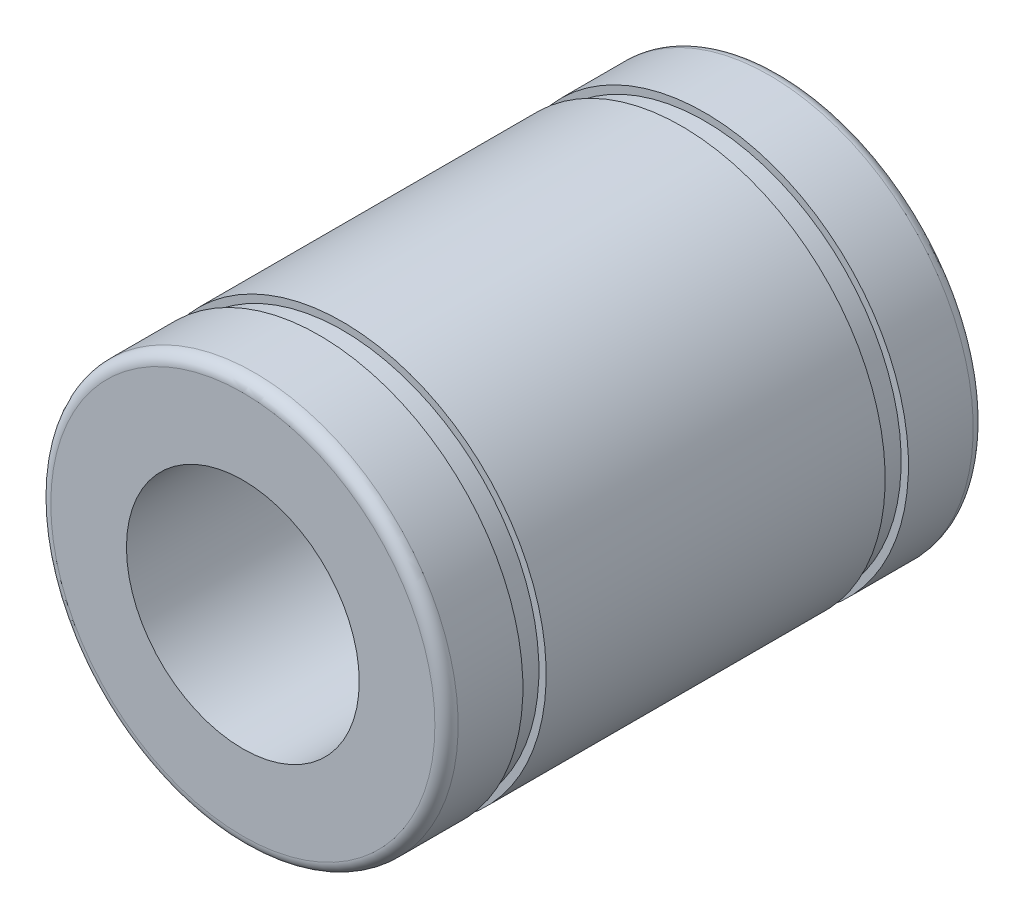
ISO-10303-21;
HEADER;
FILE_DESCRIPTION(('STEP AP214'),'2;1');
FILE_NAME('part.step','',(''),(''),'','','');
FILE_SCHEMA(('AUTOMOTIVE_DESIGN { 1 0 10303 214 1 1 1 1 }'));
ENDSEC;
DATA;
#1=APPLICATION_CONTEXT('core data for automotive mechanical design processes');
#2=APPLICATION_PROTOCOL_DEFINITION('international standard','automotive_design',2000,#1);
#3=PRODUCT_CONTEXT('',#1,'mechanical');
#4=PRODUCT('Part','Part','',(#3));
#5=PRODUCT_RELATED_PRODUCT_CATEGORY('part','',(#4));
#6=PRODUCT_DEFINITION_FORMATION('','',#4);
#7=PRODUCT_DEFINITION_CONTEXT('part definition',#1,'design');
#8=PRODUCT_DEFINITION('design','',#6,#7);
#9=PRODUCT_DEFINITION_SHAPE('','',#8);
#10=(LENGTH_UNIT() NAMED_UNIT(*) SI_UNIT(.MILLI.,.METRE.));
#11=(NAMED_UNIT(*) PLANE_ANGLE_UNIT() SI_UNIT($,.RADIAN.));
#12=(NAMED_UNIT(*) SI_UNIT($,.STERADIAN.) SOLID_ANGLE_UNIT());
#13=UNCERTAINTY_MEASURE_WITH_UNIT(LENGTH_MEASURE(1.E-05),#10,'distance_accuracy_value','');
#14=(GEOMETRIC_REPRESENTATION_CONTEXT(3) GLOBAL_UNCERTAINTY_ASSIGNED_CONTEXT((#13)) GLOBAL_UNIT_ASSIGNED_CONTEXT((#10,
#11,#12)) REPRESENTATION_CONTEXT('',''));
#15=CARTESIAN_POINT('',(0.,0.,0.));
#16=DIRECTION('',(0.,0.,1.));
#17=DIRECTION('',(1.,0.,0.));
#18=AXIS2_PLACEMENT_3D('',#15,#16,#17);
#19=CARTESIAN_POINT('',(0.,0.,0.));
#20=DIRECTION('',(0.,0.,-1.));
#21=DIRECTION('',(-1.,0.,0.));
#22=AXIS2_PLACEMENT_3D('',#19,#20,#21);
#23=CYLINDRICAL_SURFACE('',#22,8.);
#24=CARTESIAN_POINT('',(0.,0.,-18.5));
#25=DIRECTION('',(0.,0.,-1.));
#26=DIRECTION('',(-1.,0.,0.));
#27=AXIS2_PLACEMENT_3D('',#24,#25,#26);
#28=CIRCLE('',#27,8.);
#29=CARTESIAN_POINT('',(-8.,0.,-18.5));
#30=VERTEX_POINT('',#29);
#31=EDGE_CURVE('E178',#30,#30,#28,.F.);
#32=ORIENTED_EDGE('',*,*,#31,.F.);
#33=EDGE_LOOP('',(#32));
#34=FACE_BOUND('',#33,.T.);
#35=CARTESIAN_POINT('',(0.,0.,18.5));
#36=DIRECTION('',(0.,0.,-1.));
#37=DIRECTION('',(-1.,0.,0.));
#38=AXIS2_PLACEMENT_3D('',#35,#36,#37);
#39=CIRCLE('',#38,8.);
#40=CARTESIAN_POINT('',(-8.,0.,18.5));
#41=VERTEX_POINT('',#40);
#42=EDGE_CURVE('E63',#41,#41,#39,.T.);
#43=ORIENTED_EDGE('',*,*,#42,.F.);
#44=EDGE_LOOP('',(#43));
#45=FACE_BOUND('',#44,.T.);
#46=ADVANCED_FACE('F17',(#34,#45),#23,.F.);
#47=CARTESIAN_POINT('',(0.,-10.6,-18.5));
#48=DIRECTION('',(0.,0.,-1.));
#49=DIRECTION('',(-1.,0.,0.));
#50=AXIS2_PLACEMENT_3D('',#47,#48,#49);
#51=PLANE('',#50);
#52=ORIENTED_EDGE('',*,*,#31,.T.);
#53=EDGE_LOOP('',(#52));
#54=FACE_BOUND('',#53,.T.);
#55=CARTESIAN_POINT('',(0.,0.,-18.5));
#56=DIRECTION('',(0.,0.,1.));
#57=DIRECTION('',(-1.,0.,0.));
#58=AXIS2_PLACEMENT_3D('',#55,#56,#57);
#59=CIRCLE('',#58,13.2);
#60=CARTESIAN_POINT('',(-13.2,0.,-18.5));
#61=VERTEX_POINT('',#60);
#62=CARTESIAN_POINT('',(0.,-13.2,-18.5));
#63=VERTEX_POINT('',#62);
#64=EDGE_CURVE('E57',#61,#63,#59,.T.);
#65=ORIENTED_EDGE('',*,*,#64,.F.);
#66=CARTESIAN_POINT('',(0.,0.,-18.5));
#67=DIRECTION('',(0.,0.,1.));
#68=DIRECTION('',(1.,0.,0.));
#69=AXIS2_PLACEMENT_3D('',#66,#67,#68);
#70=CIRCLE('',#69,13.2);
#71=CARTESIAN_POINT('',(13.2,0.,-18.5));
#72=VERTEX_POINT('',#71);
#73=EDGE_CURVE('E53',#72,#61,#70,.T.);
#74=ORIENTED_EDGE('',*,*,#73,.F.);
#75=CARTESIAN_POINT('',(0.,0.,-18.5));
#76=DIRECTION('',(0.,0.,1.));
#77=DIRECTION('',(0.,-1.,0.));
#78=AXIS2_PLACEMENT_3D('',#75,#76,#77);
#79=CIRCLE('',#78,13.2);
#80=EDGE_CURVE('E59',#63,#72,#79,.T.);
#81=ORIENTED_EDGE('',*,*,#80,.F.);
#82=EDGE_LOOP('',(#65,#74,#81));
#83=FACE_BOUND('',#82,.T.);
#84=ADVANCED_FACE('F66',(#54,#83),#51,.T.);
#85=CARTESIAN_POINT('',(0.,-10.6,18.5));
#86=DIRECTION('',(0.,0.,1.));
#87=DIRECTION('',(1.,0.,0.));
#88=AXIS2_PLACEMENT_3D('',#85,#86,#87);
#89=PLANE('',#88);
#90=CARTESIAN_POINT('',(0.,0.,18.5));
#91=DIRECTION('',(0.,0.,-1.));
#92=DIRECTION('',(-1.,0.,0.));
#93=AXIS2_PLACEMENT_3D('',#90,#91,#92);
#94=CIRCLE('',#93,13.2);
#95=CARTESIAN_POINT('',(-13.2,0.,18.5));
#96=VERTEX_POINT('',#95);
#97=CARTESIAN_POINT('',(13.2,0.,18.5));
#98=VERTEX_POINT('',#97);
#99=EDGE_CURVE('E121',#96,#98,#94,.T.);
#100=ORIENTED_EDGE('',*,*,#99,.F.);
#101=CARTESIAN_POINT('',(0.,0.,18.5));
#102=DIRECTION('',(0.,0.,-1.));
#103=DIRECTION('',(0.,-1.,0.));
#104=AXIS2_PLACEMENT_3D('',#101,#102,#103);
#105=CIRCLE('',#104,13.2);
#106=CARTESIAN_POINT('',(0.,-13.2,18.5));
#107=VERTEX_POINT('',#106);
#108=EDGE_CURVE('E141',#107,#96,#105,.T.);
#109=ORIENTED_EDGE('',*,*,#108,.F.);
#110=CARTESIAN_POINT('',(0.,0.,18.5));
#111=DIRECTION('',(0.,0.,-1.));
#112=DIRECTION('',(1.,0.,0.));
#113=AXIS2_PLACEMENT_3D('',#110,#111,#112);
#114=CIRCLE('',#113,13.2);
#115=EDGE_CURVE('E37',#98,#107,#114,.T.);
#116=ORIENTED_EDGE('',*,*,#115,.F.);
#117=EDGE_LOOP('',(#100,#109,#116));
#118=FACE_BOUND('',#117,.T.);
#119=ORIENTED_EDGE('',*,*,#42,.T.);
#120=EDGE_LOOP('',(#119));
#121=FACE_BOUND('',#120,.T.);
#122=ADVANCED_FACE('F83',(#118,#121),#89,.T.);
#123=CARTESIAN_POINT('',(0.,0.,-17.7));
#124=DIRECTION('',(0.,0.,1.));
#125=DIRECTION('',(-1.,0.,0.));
#126=AXIS2_PLACEMENT_3D('',#123,#124,#125);
#127=TOROIDAL_SURFACE('',#126,13.2,0.799999999999997);
#128=ORIENTED_EDGE('',*,*,#73,.T.);
#129=ORIENTED_EDGE('',*,*,#64,.T.);
#130=ORIENTED_EDGE('',*,*,#80,.T.);
#131=EDGE_LOOP('',(#128,#129,#130));
#132=FACE_BOUND('',#131,.T.);
#133=CARTESIAN_POINT('',(0.,0.,-17.7));
#134=DIRECTION('',(0.,0.,-1.));
#135=DIRECTION('',(-1.,0.,0.));
#136=AXIS2_PLACEMENT_3D('',#133,#134,#135);
#137=CIRCLE('',#136,14.);
#138=CARTESIAN_POINT('',(-14.,0.,-17.7));
#139=VERTEX_POINT('',#138);
#140=EDGE_CURVE('E118',#139,#139,#137,.F.);
#141=ORIENTED_EDGE('',*,*,#140,.F.);
#142=EDGE_LOOP('',(#141));
#143=FACE_BOUND('',#142,.T.);
#144=ADVANCED_FACE('F55',(#132,#143),#127,.T.);
#145=CARTESIAN_POINT('',(0.,0.,17.7));
#146=DIRECTION('',(0.,0.,1.));
#147=DIRECTION('',(-1.,0.,0.));
#148=AXIS2_PLACEMENT_3D('',#145,#146,#147);
#149=TOROIDAL_SURFACE('',#148,13.2,0.799999999999999);
#150=ORIENTED_EDGE('',*,*,#108,.T.);
#151=ORIENTED_EDGE('',*,*,#99,.T.);
#152=ORIENTED_EDGE('',*,*,#115,.T.);
#153=EDGE_LOOP('',(#150,#151,#152));
#154=FACE_BOUND('',#153,.T.);
#155=CARTESIAN_POINT('',(0.,0.,17.7));
#156=DIRECTION('',(0.,0.,-1.));
#157=DIRECTION('',(-1.,0.,0.));
#158=AXIS2_PLACEMENT_3D('',#155,#156,#157);
#159=CIRCLE('',#158,14.);
#160=CARTESIAN_POINT('',(-14.,0.,17.7));
#161=VERTEX_POINT('',#160);
#162=EDGE_CURVE('E120',#161,#161,#159,.T.);
#163=ORIENTED_EDGE('',*,*,#162,.F.);
#164=EDGE_LOOP('',(#163));
#165=FACE_BOUND('',#164,.T.);
#166=ADVANCED_FACE('F108',(#154,#165),#149,.T.);
#167=CARTESIAN_POINT('',(0.,0.,-15.475));
#168=DIRECTION('',(0.,0.,-1.));
#169=DIRECTION('',(-1.,0.,0.));
#170=AXIS2_PLACEMENT_3D('',#167,#168,#169);
#171=CYLINDRICAL_SURFACE('',#170,14.);
#172=CARTESIAN_POINT('',(0.,0.,-13.25));
#173=DIRECTION('',(0.,0.,-1.));
#174=DIRECTION('',(-1.,0.,0.));
#175=AXIS2_PLACEMENT_3D('',#172,#173,#174);
#176=CIRCLE('',#175,14.);
#177=CARTESIAN_POINT('',(-14.,0.,-13.25));
#178=VERTEX_POINT('',#177);
#179=EDGE_CURVE('E183',#178,#178,#176,.F.);
#180=ORIENTED_EDGE('',*,*,#179,.F.);
#181=EDGE_LOOP('',(#180));
#182=FACE_BOUND('',#181,.T.);
#183=ORIENTED_EDGE('',*,*,#140,.T.);
#184=EDGE_LOOP('',(#183));
#185=FACE_BOUND('',#184,.T.);
#186=ADVANCED_FACE('F280',(#182,#185),#171,.T.);
#187=CARTESIAN_POINT('',(0.,0.,15.475));
#188=DIRECTION('',(0.,0.,-1.));
#189=DIRECTION('',(-1.,0.,0.));
#190=AXIS2_PLACEMENT_3D('',#187,#188,#189);
#191=CYLINDRICAL_SURFACE('',#190,14.);
#192=ORIENTED_EDGE('',*,*,#162,.T.);
#193=EDGE_LOOP('',(#192));
#194=FACE_BOUND('',#193,.T.);
#195=CARTESIAN_POINT('',(0.,0.,13.25));
#196=DIRECTION('',(0.,0.,-1.));
#197=DIRECTION('',(-1.,0.,0.));
#198=AXIS2_PLACEMENT_3D('',#195,#196,#197);
#199=CIRCLE('',#198,14.);
#200=CARTESIAN_POINT('',(-14.,0.,13.25));
#201=VERTEX_POINT('',#200);
#202=EDGE_CURVE('E186',#201,#201,#199,.T.);
#203=ORIENTED_EDGE('',*,*,#202,.F.);
#204=EDGE_LOOP('',(#203));
#205=FACE_BOUND('',#204,.T.);
#206=ADVANCED_FACE('F272',(#194,#205),#191,.T.);
#207=CARTESIAN_POINT('',(0.,-13.75,-13.25));
#208=DIRECTION('',(0.,0.,1.));
#209=DIRECTION('',(1.,0.,0.));
#210=AXIS2_PLACEMENT_3D('',#207,#208,#209);
#211=PLANE('',#210);
#212=ORIENTED_EDGE('',*,*,#179,.T.);
#213=EDGE_LOOP('',(#212));
#214=FACE_BOUND('',#213,.T.);
#215=CARTESIAN_POINT('',(0.,0.,-13.25));
#216=DIRECTION('',(0.,0.,-1.));
#217=DIRECTION('',(-1.,0.,0.));
#218=AXIS2_PLACEMENT_3D('',#215,#216,#217);
#219=CIRCLE('',#218,13.5);
#220=CARTESIAN_POINT('',(-13.5,0.,-13.25));
#221=VERTEX_POINT('',#220);
#222=EDGE_CURVE('E189',#221,#221,#219,.F.);
#223=ORIENTED_EDGE('',*,*,#222,.F.);
#224=EDGE_LOOP('',(#223));
#225=FACE_BOUND('',#224,.T.);
#226=ADVANCED_FACE('F264',(#214,#225),#211,.T.);
#227=CARTESIAN_POINT('',(0.,-13.75,13.25));
#228=DIRECTION('',(0.,0.,-1.));
#229=DIRECTION('',(-1.,0.,0.));
#230=AXIS2_PLACEMENT_3D('',#227,#228,#229);
#231=PLANE('',#230);
#232=CARTESIAN_POINT('',(0.,0.,13.25));
#233=DIRECTION('',(0.,0.,-1.));
#234=DIRECTION('',(-1.,0.,0.));
#235=AXIS2_PLACEMENT_3D('',#232,#233,#234);
#236=CIRCLE('',#235,13.5);
#237=CARTESIAN_POINT('',(-13.5,0.,13.25));
#238=VERTEX_POINT('',#237);
#239=EDGE_CURVE('E192',#238,#238,#236,.T.);
#240=ORIENTED_EDGE('',*,*,#239,.F.);
#241=EDGE_LOOP('',(#240));
#242=FACE_BOUND('',#241,.T.);
#243=ORIENTED_EDGE('',*,*,#202,.T.);
#244=EDGE_LOOP('',(#243));
#245=FACE_BOUND('',#244,.T.);
#246=ADVANCED_FACE('F256',(#242,#245),#231,.T.);
#247=CARTESIAN_POINT('',(0.,0.,-12.45));
#248=DIRECTION('',(0.,0.,-1.));
#249=DIRECTION('',(-1.,0.,0.));
#250=AXIS2_PLACEMENT_3D('',#247,#248,#249);
#251=CYLINDRICAL_SURFACE('',#250,13.5);
#252=CARTESIAN_POINT('',(0.,0.,-11.65));
#253=DIRECTION('',(0.,0.,-1.));
#254=DIRECTION('',(-1.,0.,0.));
#255=AXIS2_PLACEMENT_3D('',#252,#253,#254);
#256=CIRCLE('',#255,13.5);
#257=CARTESIAN_POINT('',(-13.5,0.,-11.65));
#258=VERTEX_POINT('',#257);
#259=EDGE_CURVE('E195',#258,#258,#256,.F.);
#260=ORIENTED_EDGE('',*,*,#259,.F.);
#261=EDGE_LOOP('',(#260));
#262=FACE_BOUND('',#261,.T.);
#263=ORIENTED_EDGE('',*,*,#222,.T.);
#264=EDGE_LOOP('',(#263));
#265=FACE_BOUND('',#264,.T.);
#266=ADVANCED_FACE('F227',(#262,#265),#251,.T.);
#267=CARTESIAN_POINT('',(0.,0.,12.45));
#268=DIRECTION('',(0.,0.,-1.));
#269=DIRECTION('',(-1.,0.,0.));
#270=AXIS2_PLACEMENT_3D('',#267,#268,#269);
#271=CYLINDRICAL_SURFACE('',#270,13.5);
#272=ORIENTED_EDGE('',*,*,#239,.T.);
#273=EDGE_LOOP('',(#272));
#274=FACE_BOUND('',#273,.T.);
#275=CARTESIAN_POINT('',(0.,0.,11.65));
#276=DIRECTION('',(0.,0.,-1.));
#277=DIRECTION('',(-1.,0.,0.));
#278=AXIS2_PLACEMENT_3D('',#275,#276,#277);
#279=CIRCLE('',#278,13.5);
#280=CARTESIAN_POINT('',(-13.5,0.,11.65));
#281=VERTEX_POINT('',#280);
#282=EDGE_CURVE('E198',#281,#281,#279,.T.);
#283=ORIENTED_EDGE('',*,*,#282,.F.);
#284=EDGE_LOOP('',(#283));
#285=FACE_BOUND('',#284,.T.);
#286=ADVANCED_FACE('F217',(#274,#285),#271,.T.);
#287=CARTESIAN_POINT('',(0.,-13.75,-11.65));
#288=DIRECTION('',(0.,0.,-1.));
#289=DIRECTION('',(-1.,0.,0.));
#290=AXIS2_PLACEMENT_3D('',#287,#288,#289);
#291=PLANE('',#290);
#292=ORIENTED_EDGE('',*,*,#259,.T.);
#293=EDGE_LOOP('',(#292));
#294=FACE_BOUND('',#293,.T.);
#295=CARTESIAN_POINT('',(0.,0.,-11.65));
#296=DIRECTION('',(0.,0.,-1.));
#297=DIRECTION('',(-1.,0.,0.));
#298=AXIS2_PLACEMENT_3D('',#295,#296,#297);
#299=CIRCLE('',#298,14.);
#300=CARTESIAN_POINT('',(-14.,0.,-11.65));
#301=VERTEX_POINT('',#300);
#302=EDGE_CURVE('E28',#301,#301,#299,.F.);
#303=ORIENTED_EDGE('',*,*,#302,.F.);
#304=EDGE_LOOP('',(#303));
#305=FACE_BOUND('',#304,.T.);
#306=ADVANCED_FACE('F214',(#294,#305),#291,.T.);
#307=CARTESIAN_POINT('',(0.,-13.75,11.65));
#308=DIRECTION('',(0.,0.,1.));
#309=DIRECTION('',(0.,-1.,0.));
#310=AXIS2_PLACEMENT_3D('',#307,#308,#309);
#311=PLANE('',#310);
#312=CARTESIAN_POINT('',(0.,0.,11.65));
#313=DIRECTION('',(0.,0.,-1.));
#314=DIRECTION('',(-1.,0.,0.));
#315=AXIS2_PLACEMENT_3D('',#312,#313,#314);
#316=CIRCLE('',#315,14.);
#317=CARTESIAN_POINT('',(-14.,0.,11.65));
#318=VERTEX_POINT('',#317);
#319=EDGE_CURVE('E11',#318,#318,#316,.T.);
#320=ORIENTED_EDGE('',*,*,#319,.F.);
#321=EDGE_LOOP('',(#320));
#322=FACE_BOUND('',#321,.T.);
#323=ORIENTED_EDGE('',*,*,#282,.T.);
#324=EDGE_LOOP('',(#323));
#325=FACE_BOUND('',#324,.T.);
#326=ADVANCED_FACE('F216',(#322,#325),#311,.T.);
#327=CARTESIAN_POINT('',(0.,0.,0.));
#328=DIRECTION('',(0.,0.,-1.));
#329=DIRECTION('',(-1.,0.,0.));
#330=AXIS2_PLACEMENT_3D('',#327,#328,#329);
#331=CYLINDRICAL_SURFACE('',#330,14.);
#332=ORIENTED_EDGE('',*,*,#302,.T.);
#333=EDGE_LOOP('',(#332));
#334=FACE_BOUND('',#333,.T.);
#335=ORIENTED_EDGE('',*,*,#319,.T.);
#336=EDGE_LOOP('',(#335));
#337=FACE_BOUND('',#336,.T.);
#338=ADVANCED_FACE('F211',(#334,#337),#331,.T.);
#339=CLOSED_SHELL('',(#46,#84,#122,#144,#166,#186,#206,#226,#246,#266,#286,#306,#326,#338));
#340=MANIFOLD_SOLID_BREP('B1',#339);
#341=ADVANCED_BREP_SHAPE_REPRESENTATION('',(#18,#340),#14);
#342=SHAPE_DEFINITION_REPRESENTATION(#9,#341);
ENDSEC;
END-ISO-10303-21;
